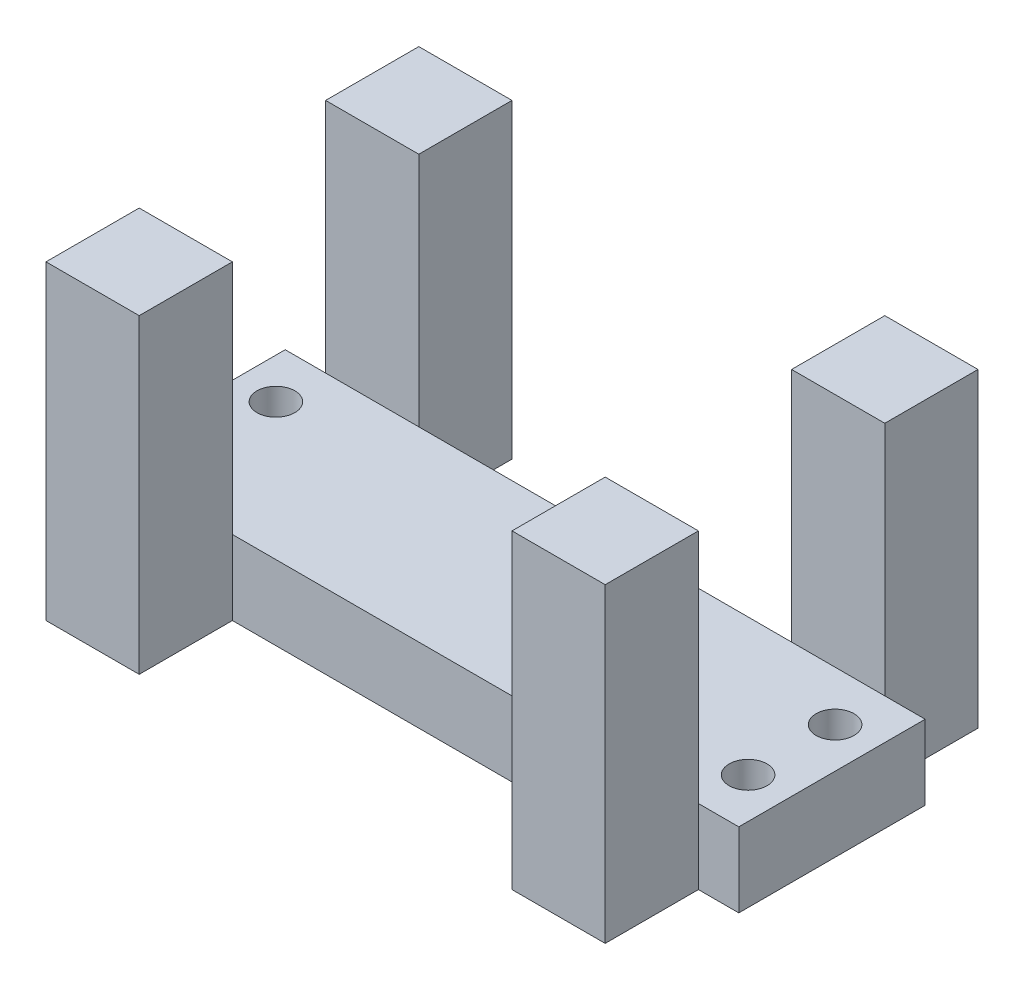
ISO-10303-21;
HEADER;
FILE_DESCRIPTION(('STEP AP214'),'2;1');
FILE_NAME('part.step','',(''),(''),'','','');
FILE_SCHEMA(('AUTOMOTIVE_DESIGN { 1 0 10303 214 1 1 1 1 }'));
ENDSEC;
DATA;
#1=APPLICATION_CONTEXT('core data for automotive mechanical design processes');
#2=APPLICATION_PROTOCOL_DEFINITION('international standard','automotive_design',2000,#1);
#3=PRODUCT_CONTEXT('',#1,'mechanical');
#4=PRODUCT('Part','Part','',(#3));
#5=PRODUCT_RELATED_PRODUCT_CATEGORY('part','',(#4));
#6=PRODUCT_DEFINITION_FORMATION('','',#4);
#7=PRODUCT_DEFINITION_CONTEXT('part definition',#1,'design');
#8=PRODUCT_DEFINITION('design','',#6,#7);
#9=PRODUCT_DEFINITION_SHAPE('','',#8);
#10=(LENGTH_UNIT() NAMED_UNIT(*) SI_UNIT(.MILLI.,.METRE.));
#11=(NAMED_UNIT(*) PLANE_ANGLE_UNIT() SI_UNIT($,.RADIAN.));
#12=(NAMED_UNIT(*) SI_UNIT($,.STERADIAN.) SOLID_ANGLE_UNIT());
#13=UNCERTAINTY_MEASURE_WITH_UNIT(LENGTH_MEASURE(1.E-05),#10,'distance_accuracy_value','');
#14=(GEOMETRIC_REPRESENTATION_CONTEXT(3) GLOBAL_UNCERTAINTY_ASSIGNED_CONTEXT((#13)) GLOBAL_UNIT_ASSIGNED_CONTEXT((#10,
#11,#12)) REPRESENTATION_CONTEXT('',''));
#15=CARTESIAN_POINT('',(0.,0.,0.));
#16=DIRECTION('',(0.,0.,1.));
#17=DIRECTION('',(1.,0.,0.));
#18=AXIS2_PLACEMENT_3D('',#15,#16,#17);
#19=CARTESIAN_POINT('',(0.,12.,0.));
#20=DIRECTION('',(0.,0.,-1.));
#21=DIRECTION('',(-1.,0.,0.));
#22=AXIS2_PLACEMENT_3D('',#19,#20,#21);
#23=PLANE('',#22);
#24=DIRECTION('',(1.,0.,0.));
#25=VECTOR('',#24,1.);
#26=CARTESIAN_POINT('',(0.,0.,0.));
#27=LINE('',#26,#25);
#28=CARTESIAN_POINT('',(0.,0.,0.));
#29=VERTEX_POINT('',#28);
#30=CARTESIAN_POINT('',(6.50000000000001,0.,0.));
#31=VERTEX_POINT('',#30);
#32=EDGE_CURVE('E388',#29,#31,#27,.T.);
#33=ORIENTED_EDGE('',*,*,#32,.T.);
#34=DIRECTION('',(0.,-1.,0.));
#35=VECTOR('',#34,1.);
#36=CARTESIAN_POINT('',(6.50000000000001,50.,0.));
#37=LINE('',#36,#35);
#38=CARTESIAN_POINT('',(6.50000000000001,12.,0.));
#39=VERTEX_POINT('',#38);
#40=EDGE_CURVE('E61',#39,#31,#37,.T.);
#41=ORIENTED_EDGE('',*,*,#40,.F.);
#42=DIRECTION('',(1.,0.,0.));
#43=VECTOR('',#42,1.);
#44=CARTESIAN_POINT('',(0.,12.,0.));
#45=LINE('',#44,#43);
#46=CARTESIAN_POINT('',(0.,12.,0.));
#47=VERTEX_POINT('',#46);
#48=EDGE_CURVE('E373',#47,#39,#45,.T.);
#49=ORIENTED_EDGE('',*,*,#48,.F.);
#50=DIRECTION('',(0.,-1.,0.));
#51=VECTOR('',#50,1.);
#52=CARTESIAN_POINT('',(0.,12.,0.));
#53=LINE('',#52,#51);
#54=EDGE_CURVE('E39',#47,#29,#53,.T.);
#55=ORIENTED_EDGE('',*,*,#54,.T.);
#56=EDGE_LOOP('',(#33,#41,#49,#55));
#57=FACE_BOUND('',#56,.T.);
#58=ADVANCED_FACE('F35',(#57),#23,.F.);
#59=CARTESIAN_POINT('',(0.,12.,-30.));
#60=DIRECTION('',(0.,0.,1.));
#61=DIRECTION('',(1.,0.,0.));
#62=AXIS2_PLACEMENT_3D('',#59,#60,#61);
#63=PLANE('',#62);
#64=DIRECTION('',(-1.,0.,0.));
#65=VECTOR('',#64,1.);
#66=CARTESIAN_POINT('',(0.,0.,-30.));
#67=LINE('',#66,#65);
#68=CARTESIAN_POINT('',(103.,0.,-30.));
#69=VERTEX_POINT('',#68);
#70=CARTESIAN_POINT('',(96.5,0.,-30.));
#71=VERTEX_POINT('',#70);
#72=EDGE_CURVE('E372',#69,#71,#67,.T.);
#73=ORIENTED_EDGE('',*,*,#72,.T.);
#74=DIRECTION('',(0.,-1.,0.));
#75=VECTOR('',#74,1.);
#76=CARTESIAN_POINT('',(96.5,50.,-30.));
#77=LINE('',#76,#75);
#78=CARTESIAN_POINT('',(96.5,12.,-30.));
#79=VERTEX_POINT('',#78);
#80=EDGE_CURVE('E259',#79,#71,#77,.T.);
#81=ORIENTED_EDGE('',*,*,#80,.F.);
#82=DIRECTION('',(-1.,0.,0.));
#83=VECTOR('',#82,1.);
#84=CARTESIAN_POINT('',(0.,12.,-30.));
#85=LINE('',#84,#83);
#86=CARTESIAN_POINT('',(103.,12.,-30.));
#87=VERTEX_POINT('',#86);
#88=EDGE_CURVE('E379',#87,#79,#85,.T.);
#89=ORIENTED_EDGE('',*,*,#88,.F.);
#90=DIRECTION('',(0.,-1.,0.));
#91=VECTOR('',#90,1.);
#92=CARTESIAN_POINT('',(103.,12.,-30.));
#93=LINE('',#92,#91);
#94=EDGE_CURVE('E398',#87,#69,#93,.T.);
#95=ORIENTED_EDGE('',*,*,#94,.T.);
#96=EDGE_LOOP('',(#73,#81,#89,#95));
#97=FACE_BOUND('',#96,.T.);
#98=ADVANCED_FACE('F460',(#97),#63,.F.);
#99=CARTESIAN_POINT('',(81.5,12.,-30.));
#100=VERTEX_POINT('',#99);
#101=CARTESIAN_POINT('',(21.5,12.,-30.));
#102=VERTEX_POINT('',#101);
#103=EDGE_CURVE('E383',#100,#102,#85,.T.);
#104=ORIENTED_EDGE('',*,*,#103,.F.);
#105=DIRECTION('',(0.,-1.,0.));
#106=VECTOR('',#105,1.);
#107=CARTESIAN_POINT('',(81.5,50.,-30.));
#108=LINE('',#107,#106);
#109=CARTESIAN_POINT('',(81.5,0.,-30.));
#110=VERTEX_POINT('',#109);
#111=EDGE_CURVE('E275',#100,#110,#108,.T.);
#112=ORIENTED_EDGE('',*,*,#111,.T.);
#113=CARTESIAN_POINT('',(21.5,0.,-30.));
#114=VERTEX_POINT('',#113);
#115=EDGE_CURVE('E395',#110,#114,#67,.T.);
#116=ORIENTED_EDGE('',*,*,#115,.T.);
#117=DIRECTION('',(0.,-1.,0.));
#118=VECTOR('',#117,1.);
#119=CARTESIAN_POINT('',(21.5,50.,-30.));
#120=LINE('',#119,#118);
#121=EDGE_CURVE('E11',#102,#114,#120,.T.);
#122=ORIENTED_EDGE('',*,*,#121,.F.);
#123=EDGE_LOOP('',(#104,#112,#116,#122));
#124=FACE_BOUND('',#123,.T.);
#125=ADVANCED_FACE('F429',(#124),#63,.F.);
#126=CARTESIAN_POINT('',(21.5,12.,0.));
#127=VERTEX_POINT('',#126);
#128=CARTESIAN_POINT('',(81.5,12.,0.));
#129=VERTEX_POINT('',#128);
#130=EDGE_CURVE('E53',#127,#129,#45,.T.);
#131=ORIENTED_EDGE('',*,*,#130,.F.);
#132=DIRECTION('',(0.,-1.,0.));
#133=VECTOR('',#132,1.);
#134=CARTESIAN_POINT('',(21.5,50.,0.));
#135=LINE('',#134,#133);
#136=CARTESIAN_POINT('',(21.5,0.,0.));
#137=VERTEX_POINT('',#136);
#138=EDGE_CURVE('E206',#127,#137,#135,.T.);
#139=ORIENTED_EDGE('',*,*,#138,.T.);
#140=CARTESIAN_POINT('',(81.5,0.,0.));
#141=VERTEX_POINT('',#140);
#142=EDGE_CURVE('E391',#137,#141,#27,.T.);
#143=ORIENTED_EDGE('',*,*,#142,.T.);
#144=DIRECTION('',(0.,-1.,0.));
#145=VECTOR('',#144,1.);
#146=CARTESIAN_POINT('',(81.5,50.,0.));
#147=LINE('',#146,#145);
#148=EDGE_CURVE('E341',#129,#141,#147,.T.);
#149=ORIENTED_EDGE('',*,*,#148,.F.);
#150=EDGE_LOOP('',(#131,#139,#143,#149));
#151=FACE_BOUND('',#150,.T.);
#152=ADVANCED_FACE('F453',(#151),#23,.F.);
#153=CARTESIAN_POINT('',(0.,12.,0.));
#154=DIRECTION('',(1.,0.,0.));
#155=DIRECTION('',(0.,0.,-1.));
#156=AXIS2_PLACEMENT_3D('',#153,#154,#155);
#157=PLANE('',#156);
#158=DIRECTION('',(0.,0.,1.));
#159=VECTOR('',#158,1.);
#160=CARTESIAN_POINT('',(0.,0.,0.));
#161=LINE('',#160,#159);
#162=CARTESIAN_POINT('',(0.,0.,-30.));
#163=VERTEX_POINT('',#162);
#164=EDGE_CURVE('E365',#163,#29,#161,.T.);
#165=ORIENTED_EDGE('',*,*,#164,.T.);
#166=ORIENTED_EDGE('',*,*,#54,.F.);
#167=DIRECTION('',(0.,0.,1.));
#168=VECTOR('',#167,1.);
#169=CARTESIAN_POINT('',(0.,12.,0.));
#170=LINE('',#169,#168);
#171=CARTESIAN_POINT('',(0.,12.,-30.));
#172=VERTEX_POINT('',#171);
#173=EDGE_CURVE('E368',#172,#47,#170,.T.);
#174=ORIENTED_EDGE('',*,*,#173,.F.);
#175=DIRECTION('',(0.,-1.,0.));
#176=VECTOR('',#175,1.);
#177=CARTESIAN_POINT('',(0.,12.,-30.));
#178=LINE('',#177,#176);
#179=EDGE_CURVE('E382',#172,#163,#178,.T.);
#180=ORIENTED_EDGE('',*,*,#179,.T.);
#181=EDGE_LOOP('',(#165,#166,#174,#180));
#182=FACE_BOUND('',#181,.T.);
#183=ADVANCED_FACE('F37',(#182),#157,.F.);
#184=CARTESIAN_POINT('',(96.5,12.,0.));
#185=VERTEX_POINT('',#184);
#186=CARTESIAN_POINT('',(103.,12.,0.));
#187=VERTEX_POINT('',#186);
#188=EDGE_CURVE('E371',#185,#187,#45,.T.);
#189=ORIENTED_EDGE('',*,*,#188,.F.);
#190=DIRECTION('',(0.,-1.,0.));
#191=VECTOR('',#190,1.);
#192=CARTESIAN_POINT('',(96.5,50.,0.));
#193=LINE('',#192,#191);
#194=CARTESIAN_POINT('',(96.5,0.,0.));
#195=VERTEX_POINT('',#194);
#196=EDGE_CURVE('E337',#185,#195,#193,.T.);
#197=ORIENTED_EDGE('',*,*,#196,.T.);
#198=CARTESIAN_POINT('',(103.,0.,0.));
#199=VERTEX_POINT('',#198);
#200=EDGE_CURVE('E387',#195,#199,#27,.T.);
#201=ORIENTED_EDGE('',*,*,#200,.T.);
#202=DIRECTION('',(0.,-1.,0.));
#203=VECTOR('',#202,1.);
#204=CARTESIAN_POINT('',(103.,12.,0.));
#205=LINE('',#204,#203);
#206=EDGE_CURVE('E400',#187,#199,#205,.T.);
#207=ORIENTED_EDGE('',*,*,#206,.F.);
#208=EDGE_LOOP('',(#189,#197,#201,#207));
#209=FACE_BOUND('',#208,.T.);
#210=ADVANCED_FACE('F452',(#209),#23,.F.);
#211=CARTESIAN_POINT('',(103.,12.,0.));
#212=DIRECTION('',(-1.,0.,0.));
#213=DIRECTION('',(0.,0.,1.));
#214=AXIS2_PLACEMENT_3D('',#211,#212,#213);
#215=PLANE('',#214);
#216=DIRECTION('',(0.,0.,-1.));
#217=VECTOR('',#216,1.);
#218=CARTESIAN_POINT('',(103.,0.,0.));
#219=LINE('',#218,#217);
#220=EDGE_CURVE('E390',#199,#69,#219,.T.);
#221=ORIENTED_EDGE('',*,*,#220,.T.);
#222=ORIENTED_EDGE('',*,*,#94,.F.);
#223=DIRECTION('',(0.,0.,-1.));
#224=VECTOR('',#223,1.);
#225=CARTESIAN_POINT('',(103.,12.,0.));
#226=LINE('',#225,#224);
#227=EDGE_CURVE('E375',#187,#87,#226,.T.);
#228=ORIENTED_EDGE('',*,*,#227,.F.);
#229=ORIENTED_EDGE('',*,*,#206,.T.);
#230=EDGE_LOOP('',(#221,#222,#228,#229));
#231=FACE_BOUND('',#230,.T.);
#232=ADVANCED_FACE('F458',(#231),#215,.F.);
#233=CARTESIAN_POINT('',(6.50000000000001,12.,-30.));
#234=VERTEX_POINT('',#233);
#235=EDGE_CURVE('E378',#234,#172,#85,.T.);
#236=ORIENTED_EDGE('',*,*,#235,.F.);
#237=DIRECTION('',(0.,-1.,0.));
#238=VECTOR('',#237,1.);
#239=CARTESIAN_POINT('',(6.50000000000001,50.,-30.));
#240=LINE('',#239,#238);
#241=CARTESIAN_POINT('',(6.50000000000001,0.,-30.));
#242=VERTEX_POINT('',#241);
#243=EDGE_CURVE('E44',#234,#242,#240,.T.);
#244=ORIENTED_EDGE('',*,*,#243,.T.);
#245=EDGE_CURVE('E393',#242,#163,#67,.T.);
#246=ORIENTED_EDGE('',*,*,#245,.T.);
#247=ORIENTED_EDGE('',*,*,#179,.F.);
#248=EDGE_LOOP('',(#236,#244,#246,#247));
#249=FACE_BOUND('',#248,.T.);
#250=ADVANCED_FACE('F419',(#249),#63,.F.);
#251=CARTESIAN_POINT('',(0.,12.,0.));
#252=DIRECTION('',(0.,-1.,0.));
#253=DIRECTION('',(0.,0.,-1.));
#254=AXIS2_PLACEMENT_3D('',#251,#252,#253);
#255=PLANE('',#254);
#256=CARTESIAN_POINT('',(6.5,12.,-22.));
#257=DIRECTION('',(0.,1.,0.));
#258=DIRECTION('',(0.,0.,-1.));
#259=AXIS2_PLACEMENT_3D('',#256,#257,#258);
#260=CIRCLE('',#259,3.05);
#261=CARTESIAN_POINT('',(6.5,12.,-25.05));
#262=VERTEX_POINT('',#261);
#263=EDGE_CURVE('E354',#262,#262,#260,.T.);
#264=ORIENTED_EDGE('',*,*,#263,.F.);
#265=EDGE_LOOP('',(#264));
#266=FACE_BOUND('',#265,.T.);
#267=CARTESIAN_POINT('',(96.5,12.,-8.00000000000001));
#268=DIRECTION('',(0.,1.,0.));
#269=DIRECTION('',(0.,0.,-1.));
#270=AXIS2_PLACEMENT_3D('',#267,#268,#269);
#271=CIRCLE('',#270,3.05000000000002);
#272=CARTESIAN_POINT('',(96.5,12.,-11.05));
#273=VERTEX_POINT('',#272);
#274=EDGE_CURVE('E347',#273,#273,#271,.T.);
#275=ORIENTED_EDGE('',*,*,#274,.F.);
#276=EDGE_LOOP('',(#275));
#277=FACE_BOUND('',#276,.T.);
#278=CARTESIAN_POINT('',(96.5,12.,-22.));
#279=DIRECTION('',(0.,1.,0.));
#280=DIRECTION('',(0.,0.,1.));
#281=AXIS2_PLACEMENT_3D('',#278,#279,#280);
#282=CIRCLE('',#281,3.05);
#283=CARTESIAN_POINT('',(96.5,12.,-18.95));
#284=VERTEX_POINT('',#283);
#285=EDGE_CURVE('E335',#284,#284,#282,.T.);
#286=ORIENTED_EDGE('',*,*,#285,.F.);
#287=EDGE_LOOP('',(#286));
#288=FACE_BOUND('',#287,.T.);
#289=CARTESIAN_POINT('',(6.5,12.,-8.));
#290=DIRECTION('',(0.,1.,0.));
#291=DIRECTION('',(0.,0.,1.));
#292=AXIS2_PLACEMENT_3D('',#289,#290,#291);
#293=CIRCLE('',#292,3.05);
#294=CARTESIAN_POINT('',(6.5,12.,-4.95));
#295=VERTEX_POINT('',#294);
#296=EDGE_CURVE('E353',#295,#295,#293,.T.);
#297=ORIENTED_EDGE('',*,*,#296,.F.);
#298=EDGE_LOOP('',(#297));
#299=FACE_BOUND('',#298,.T.);
#300=ORIENTED_EDGE('',*,*,#173,.T.);
#301=ORIENTED_EDGE('',*,*,#48,.T.);
#302=DIRECTION('',(1.,0.,0.));
#303=VECTOR('',#302,1.);
#304=CARTESIAN_POINT('',(0.,12.,0.));
#305=LINE('',#304,#303);
#306=EDGE_CURVE('E240',#39,#127,#305,.T.);
#307=ORIENTED_EDGE('',*,*,#306,.T.);
#308=ORIENTED_EDGE('',*,*,#130,.T.);
#309=EDGE_CURVE('E376',#129,#185,#45,.T.);
#310=ORIENTED_EDGE('',*,*,#309,.T.);
#311=ORIENTED_EDGE('',*,*,#188,.T.);
#312=ORIENTED_EDGE('',*,*,#227,.T.);
#313=ORIENTED_EDGE('',*,*,#88,.T.);
#314=DIRECTION('',(-1.,0.,0.));
#315=VECTOR('',#314,1.);
#316=CARTESIAN_POINT('',(0.,12.,-30.));
#317=LINE('',#316,#315);
#318=EDGE_CURVE('E269',#79,#100,#317,.T.);
#319=ORIENTED_EDGE('',*,*,#318,.T.);
#320=ORIENTED_EDGE('',*,*,#103,.T.);
#321=EDGE_CURVE('E384',#102,#234,#85,.T.);
#322=ORIENTED_EDGE('',*,*,#321,.T.);
#323=ORIENTED_EDGE('',*,*,#235,.T.);
#324=EDGE_LOOP('',(#300,#301,#307,#308,#310,#311,#312,#313,#319,#320,#322,#323));
#325=FACE_BOUND('',#324,.T.);
#326=ADVANCED_FACE('F448',(#266,#277,#288,#299,#325),#255,.F.);
#327=CARTESIAN_POINT('',(0.,0.,0.));
#328=DIRECTION('',(0.,-1.,0.));
#329=DIRECTION('',(0.,0.,-1.));
#330=AXIS2_PLACEMENT_3D('',#327,#328,#329);
#331=PLANE('',#330);
#332=CARTESIAN_POINT('',(6.5,0.,-22.));
#333=DIRECTION('',(0.,1.,0.));
#334=DIRECTION('',(0.,0.,-1.));
#335=AXIS2_PLACEMENT_3D('',#332,#333,#334);
#336=CIRCLE('',#335,3.05);
#337=CARTESIAN_POINT('',(6.5,0.,-25.05));
#338=VERTEX_POINT('',#337);
#339=EDGE_CURVE('E350',#338,#338,#336,.T.);
#340=ORIENTED_EDGE('',*,*,#339,.T.);
#341=EDGE_LOOP('',(#340));
#342=FACE_BOUND('',#341,.T.);
#343=CARTESIAN_POINT('',(96.5,0.,-8.00000000000001));
#344=DIRECTION('',(0.,1.,0.));
#345=DIRECTION('',(0.,0.,-1.));
#346=AXIS2_PLACEMENT_3D('',#343,#344,#345);
#347=CIRCLE('',#346,3.05000000000002);
#348=CARTESIAN_POINT('',(96.5,0.,-11.05));
#349=VERTEX_POINT('',#348);
#350=EDGE_CURVE('E357',#349,#349,#347,.T.);
#351=ORIENTED_EDGE('',*,*,#350,.T.);
#352=EDGE_LOOP('',(#351));
#353=FACE_BOUND('',#352,.T.);
#354=CARTESIAN_POINT('',(96.5,0.,-22.));
#355=DIRECTION('',(0.,1.,0.));
#356=DIRECTION('',(0.,0.,1.));
#357=AXIS2_PLACEMENT_3D('',#354,#355,#356);
#358=CIRCLE('',#357,3.05);
#359=CARTESIAN_POINT('',(96.5,0.,-18.95));
#360=VERTEX_POINT('',#359);
#361=EDGE_CURVE('E344',#360,#360,#358,.T.);
#362=ORIENTED_EDGE('',*,*,#361,.T.);
#363=EDGE_LOOP('',(#362));
#364=FACE_BOUND('',#363,.T.);
#365=CARTESIAN_POINT('',(6.5,0.,-8.));
#366=DIRECTION('',(0.,1.,0.));
#367=DIRECTION('',(0.,0.,1.));
#368=AXIS2_PLACEMENT_3D('',#365,#366,#367);
#369=CIRCLE('',#368,3.05);
#370=CARTESIAN_POINT('',(6.5,0.,-4.95));
#371=VERTEX_POINT('',#370);
#372=EDGE_CURVE('E362',#371,#371,#369,.T.);
#373=ORIENTED_EDGE('',*,*,#372,.T.);
#374=EDGE_LOOP('',(#373));
#375=FACE_BOUND('',#374,.T.);
#376=ORIENTED_EDGE('',*,*,#164,.F.);
#377=ORIENTED_EDGE('',*,*,#245,.F.);
#378=DIRECTION('',(0.,0.,-1.));
#379=VECTOR('',#378,1.);
#380=CARTESIAN_POINT('',(6.50000000000001,0.,-30.));
#381=LINE('',#380,#379);
#382=CARTESIAN_POINT('',(6.50000000000001,0.,-45.));
#383=VERTEX_POINT('',#382);
#384=EDGE_CURVE('E281',#242,#383,#381,.T.);
#385=ORIENTED_EDGE('',*,*,#384,.T.);
#386=DIRECTION('',(1.,0.,0.));
#387=VECTOR('',#386,1.);
#388=CARTESIAN_POINT('',(6.50000000000001,0.,-45.));
#389=LINE('',#388,#387);
#390=CARTESIAN_POINT('',(21.5,0.,-45.));
#391=VERTEX_POINT('',#390);
#392=EDGE_CURVE('E298',#383,#391,#389,.T.);
#393=ORIENTED_EDGE('',*,*,#392,.T.);
#394=DIRECTION('',(0.,0.,1.));
#395=VECTOR('',#394,1.);
#396=CARTESIAN_POINT('',(21.5,0.,-30.));
#397=LINE('',#396,#395);
#398=EDGE_CURVE('E286',#391,#114,#397,.T.);
#399=ORIENTED_EDGE('',*,*,#398,.T.);
#400=ORIENTED_EDGE('',*,*,#115,.F.);
#401=DIRECTION('',(0.,0.,-1.));
#402=VECTOR('',#401,1.);
#403=CARTESIAN_POINT('',(81.5,0.,-30.));
#404=LINE('',#403,#402);
#405=CARTESIAN_POINT('',(81.5,0.,-45.));
#406=VERTEX_POINT('',#405);
#407=EDGE_CURVE('E262',#110,#406,#404,.T.);
#408=ORIENTED_EDGE('',*,*,#407,.T.);
#409=DIRECTION('',(1.,0.,0.));
#410=VECTOR('',#409,1.);
#411=CARTESIAN_POINT('',(96.5,0.,-45.));
#412=LINE('',#411,#410);
#413=CARTESIAN_POINT('',(96.5,0.,-45.));
#414=VERTEX_POINT('',#413);
#415=EDGE_CURVE('E250',#406,#414,#412,.T.);
#416=ORIENTED_EDGE('',*,*,#415,.T.);
#417=DIRECTION('',(0.,0.,1.));
#418=VECTOR('',#417,1.);
#419=CARTESIAN_POINT('',(96.5,0.,-30.));
#420=LINE('',#419,#418);
#421=EDGE_CURVE('E245',#414,#71,#420,.T.);
#422=ORIENTED_EDGE('',*,*,#421,.T.);
#423=ORIENTED_EDGE('',*,*,#72,.F.);
#424=ORIENTED_EDGE('',*,*,#220,.F.);
#425=ORIENTED_EDGE('',*,*,#200,.F.);
#426=DIRECTION('',(0.,0.,1.));
#427=VECTOR('',#426,1.);
#428=CARTESIAN_POINT('',(96.5,0.,0.));
#429=LINE('',#428,#427);
#430=CARTESIAN_POINT('',(96.5,0.,15.));
#431=VERTEX_POINT('',#430);
#432=EDGE_CURVE('E304',#195,#431,#429,.T.);
#433=ORIENTED_EDGE('',*,*,#432,.T.);
#434=DIRECTION('',(-1.,0.,0.));
#435=VECTOR('',#434,1.);
#436=CARTESIAN_POINT('',(96.5,0.,15.));
#437=LINE('',#436,#435);
#438=CARTESIAN_POINT('',(81.5,0.,15.));
#439=VERTEX_POINT('',#438);
#440=EDGE_CURVE('E327',#431,#439,#437,.T.);
#441=ORIENTED_EDGE('',*,*,#440,.T.);
#442=DIRECTION('',(0.,0.,-1.));
#443=VECTOR('',#442,1.);
#444=CARTESIAN_POINT('',(81.5,0.,0.));
#445=LINE('',#444,#443);
#446=EDGE_CURVE('E315',#439,#141,#445,.T.);
#447=ORIENTED_EDGE('',*,*,#446,.T.);
#448=ORIENTED_EDGE('',*,*,#142,.F.);
#449=DIRECTION('',(0.,0.,1.));
#450=VECTOR('',#449,1.);
#451=CARTESIAN_POINT('',(21.5,0.,0.));
#452=LINE('',#451,#450);
#453=CARTESIAN_POINT('',(21.5,0.,15.));
#454=VERTEX_POINT('',#453);
#455=EDGE_CURVE('E234',#137,#454,#452,.T.);
#456=ORIENTED_EDGE('',*,*,#455,.T.);
#457=DIRECTION('',(-1.,0.,0.));
#458=VECTOR('',#457,1.);
#459=CARTESIAN_POINT('',(6.50000000000001,0.,15.));
#460=LINE('',#459,#458);
#461=CARTESIAN_POINT('',(6.50000000000001,0.,15.));
#462=VERTEX_POINT('',#461);
#463=EDGE_CURVE('E228',#454,#462,#460,.T.);
#464=ORIENTED_EDGE('',*,*,#463,.T.);
#465=DIRECTION('',(0.,0.,-1.));
#466=VECTOR('',#465,1.);
#467=CARTESIAN_POINT('',(6.50000000000001,0.,0.));
#468=LINE('',#467,#466);
#469=EDGE_CURVE('E225',#462,#31,#468,.T.);
#470=ORIENTED_EDGE('',*,*,#469,.T.);
#471=ORIENTED_EDGE('',*,*,#32,.F.);
#472=EDGE_LOOP('',(#376,#377,#385,#393,#399,#400,#408,#416,#422,#423,#424,#425,#433,#441,#447,
#448,#456,#464,#470,#471));
#473=FACE_BOUND('',#472,.T.);
#474=ADVANCED_FACE('F425',(#342,#353,#364,#375,#473),#331,.T.);
#475=CARTESIAN_POINT('',(6.5,0.,-8.));
#476=DIRECTION('',(0.,1.,0.));
#477=DIRECTION('',(0.,0.,1.));
#478=AXIS2_PLACEMENT_3D('',#475,#476,#477);
#479=CYLINDRICAL_SURFACE('',#478,3.05);
#480=ORIENTED_EDGE('',*,*,#372,.F.);
#481=EDGE_LOOP('',(#480));
#482=FACE_BOUND('',#481,.T.);
#483=ORIENTED_EDGE('',*,*,#296,.T.);
#484=EDGE_LOOP('',(#483));
#485=FACE_BOUND('',#484,.T.);
#486=ADVANCED_FACE('F472',(#482,#485),#479,.F.);
#487=CARTESIAN_POINT('',(96.5,0.,-22.));
#488=DIRECTION('',(0.,1.,0.));
#489=DIRECTION('',(0.,0.,1.));
#490=AXIS2_PLACEMENT_3D('',#487,#488,#489);
#491=CYLINDRICAL_SURFACE('',#490,3.05);
#492=ORIENTED_EDGE('',*,*,#361,.F.);
#493=EDGE_LOOP('',(#492));
#494=FACE_BOUND('',#493,.T.);
#495=ORIENTED_EDGE('',*,*,#285,.T.);
#496=EDGE_LOOP('',(#495));
#497=FACE_BOUND('',#496,.T.);
#498=ADVANCED_FACE('F479',(#494,#497),#491,.F.);
#499=CARTESIAN_POINT('',(96.5,0.,-8.00000000000001));
#500=DIRECTION('',(0.,1.,0.));
#501=DIRECTION('',(0.,0.,1.));
#502=AXIS2_PLACEMENT_3D('',#499,#500,#501);
#503=CYLINDRICAL_SURFACE('',#502,3.05000000000002);
#504=ORIENTED_EDGE('',*,*,#350,.F.);
#505=EDGE_LOOP('',(#504));
#506=FACE_BOUND('',#505,.T.);
#507=ORIENTED_EDGE('',*,*,#274,.T.);
#508=EDGE_LOOP('',(#507));
#509=FACE_BOUND('',#508,.T.);
#510=ADVANCED_FACE('F481',(#506,#509),#503,.F.);
#511=CARTESIAN_POINT('',(6.5,0.,-22.));
#512=DIRECTION('',(0.,1.,0.));
#513=DIRECTION('',(0.,0.,1.));
#514=AXIS2_PLACEMENT_3D('',#511,#512,#513);
#515=CYLINDRICAL_SURFACE('',#514,3.05);
#516=ORIENTED_EDGE('',*,*,#339,.F.);
#517=EDGE_LOOP('',(#516));
#518=FACE_BOUND('',#517,.T.);
#519=ORIENTED_EDGE('',*,*,#263,.T.);
#520=EDGE_LOOP('',(#519));
#521=FACE_BOUND('',#520,.T.);
#522=ADVANCED_FACE('F484',(#518,#521),#515,.F.);
#523=CARTESIAN_POINT('',(96.5,50.,0.));
#524=DIRECTION('',(0.,0.,-1.));
#525=DIRECTION('',(-1.,0.,0.));
#526=AXIS2_PLACEMENT_3D('',#523,#524,#525);
#527=PLANE('',#526);
#528=ORIENTED_EDGE('',*,*,#309,.F.);
#529=CARTESIAN_POINT('',(81.5,50.,0.));
#530=VERTEX_POINT('',#529);
#531=EDGE_CURVE('E336',#530,#129,#147,.T.);
#532=ORIENTED_EDGE('',*,*,#531,.F.);
#533=DIRECTION('',(1.,0.,0.));
#534=VECTOR('',#533,1.);
#535=CARTESIAN_POINT('',(96.5,50.,0.));
#536=LINE('',#535,#534);
#537=CARTESIAN_POINT('',(96.5,50.,0.));
#538=VERTEX_POINT('',#537);
#539=EDGE_CURVE('E321',#530,#538,#536,.T.);
#540=ORIENTED_EDGE('',*,*,#539,.T.);
#541=EDGE_CURVE('E332',#538,#185,#193,.T.);
#542=ORIENTED_EDGE('',*,*,#541,.T.);
#543=EDGE_LOOP('',(#528,#532,#540,#542));
#544=FACE_BOUND('',#543,.T.);
#545=ADVANCED_FACE('F488',(#544),#527,.T.);
#546=CARTESIAN_POINT('',(96.5,50.,0.));
#547=DIRECTION('',(1.,0.,0.));
#548=DIRECTION('',(0.,0.,-1.));
#549=AXIS2_PLACEMENT_3D('',#546,#547,#548);
#550=PLANE('',#549);
#551=ORIENTED_EDGE('',*,*,#432,.F.);
#552=ORIENTED_EDGE('',*,*,#196,.F.);
#553=ORIENTED_EDGE('',*,*,#541,.F.);
#554=DIRECTION('',(0.,0.,1.));
#555=VECTOR('',#554,1.);
#556=CARTESIAN_POINT('',(96.5,50.,0.));
#557=LINE('',#556,#555);
#558=CARTESIAN_POINT('',(96.5,50.,15.));
#559=VERTEX_POINT('',#558);
#560=EDGE_CURVE('E311',#538,#559,#557,.T.);
#561=ORIENTED_EDGE('',*,*,#560,.T.);
#562=DIRECTION('',(0.,-1.,0.));
#563=VECTOR('',#562,1.);
#564=CARTESIAN_POINT('',(96.5,50.,15.));
#565=LINE('',#564,#563);
#566=EDGE_CURVE('E324',#559,#431,#565,.T.);
#567=ORIENTED_EDGE('',*,*,#566,.T.);
#568=EDGE_LOOP('',(#551,#552,#553,#561,#567));
#569=FACE_BOUND('',#568,.T.);
#570=ADVANCED_FACE('F493',(#569),#550,.T.);
#571=CARTESIAN_POINT('',(81.5,50.,0.));
#572=DIRECTION('',(-1.,0.,0.));
#573=DIRECTION('',(0.,0.,1.));
#574=AXIS2_PLACEMENT_3D('',#571,#572,#573);
#575=PLANE('',#574);
#576=ORIENTED_EDGE('',*,*,#446,.F.);
#577=DIRECTION('',(0.,-1.,0.));
#578=VECTOR('',#577,1.);
#579=CARTESIAN_POINT('',(81.5,50.,15.));
#580=LINE('',#579,#578);
#581=CARTESIAN_POINT('',(81.5,50.,15.));
#582=VERTEX_POINT('',#581);
#583=EDGE_CURVE('E340',#582,#439,#580,.T.);
#584=ORIENTED_EDGE('',*,*,#583,.F.);
#585=DIRECTION('',(0.,0.,-1.));
#586=VECTOR('',#585,1.);
#587=CARTESIAN_POINT('',(81.5,50.,0.));
#588=LINE('',#587,#586);
#589=EDGE_CURVE('E318',#582,#530,#588,.T.);
#590=ORIENTED_EDGE('',*,*,#589,.T.);
#591=ORIENTED_EDGE('',*,*,#531,.T.);
#592=ORIENTED_EDGE('',*,*,#148,.T.);
#593=EDGE_LOOP('',(#576,#584,#590,#591,#592));
#594=FACE_BOUND('',#593,.T.);
#595=ADVANCED_FACE('F496',(#594),#575,.T.);
#596=CARTESIAN_POINT('',(96.5,50.,15.));
#597=DIRECTION('',(0.,0.,1.));
#598=DIRECTION('',(1.,0.,0.));
#599=AXIS2_PLACEMENT_3D('',#596,#597,#598);
#600=PLANE('',#599);
#601=ORIENTED_EDGE('',*,*,#440,.F.);
#602=ORIENTED_EDGE('',*,*,#566,.F.);
#603=DIRECTION('',(-1.,0.,0.));
#604=VECTOR('',#603,1.);
#605=CARTESIAN_POINT('',(96.5,50.,15.));
#606=LINE('',#605,#604);
#607=EDGE_CURVE('E314',#559,#582,#606,.T.);
#608=ORIENTED_EDGE('',*,*,#607,.T.);
#609=ORIENTED_EDGE('',*,*,#583,.T.);
#610=EDGE_LOOP('',(#601,#602,#608,#609));
#611=FACE_BOUND('',#610,.T.);
#612=ADVANCED_FACE('F498',(#611),#600,.T.);
#613=CARTESIAN_POINT('',(0.,50.,0.));
#614=DIRECTION('',(0.,-1.,0.));
#615=DIRECTION('',(0.,0.,-1.));
#616=AXIS2_PLACEMENT_3D('',#613,#614,#615);
#617=PLANE('',#616);
#618=ORIENTED_EDGE('',*,*,#560,.F.);
#619=ORIENTED_EDGE('',*,*,#539,.F.);
#620=ORIENTED_EDGE('',*,*,#589,.F.);
#621=ORIENTED_EDGE('',*,*,#607,.F.);
#622=EDGE_LOOP('',(#618,#619,#620,#621));
#623=FACE_BOUND('',#622,.T.);
#624=ADVANCED_FACE('F501',(#623),#617,.F.);
#625=CARTESIAN_POINT('',(6.50000000000001,50.,-30.));
#626=DIRECTION('',(0.,0.,1.));
#627=DIRECTION('',(1.,0.,0.));
#628=AXIS2_PLACEMENT_3D('',#625,#626,#627);
#629=PLANE('',#628);
#630=ORIENTED_EDGE('',*,*,#321,.F.);
#631=CARTESIAN_POINT('',(21.5,50.,-30.));
#632=VERTEX_POINT('',#631);
#633=EDGE_CURVE('E46',#632,#102,#120,.T.);
#634=ORIENTED_EDGE('',*,*,#633,.F.);
#635=DIRECTION('',(-1.,0.,0.));
#636=VECTOR('',#635,1.);
#637=CARTESIAN_POINT('',(6.50000000000001,50.,-30.));
#638=LINE('',#637,#636);
#639=CARTESIAN_POINT('',(6.50000000000001,50.,-30.));
#640=VERTEX_POINT('',#639);
#641=EDGE_CURVE('E282',#632,#640,#638,.T.);
#642=ORIENTED_EDGE('',*,*,#641,.T.);
#643=EDGE_CURVE('E295',#640,#234,#240,.T.);
#644=ORIENTED_EDGE('',*,*,#643,.T.);
#645=EDGE_LOOP('',(#630,#634,#642,#644));
#646=FACE_BOUND('',#645,.T.);
#647=ADVANCED_FACE('F446',(#646),#629,.T.);
#648=CARTESIAN_POINT('',(21.5,50.,-30.));
#649=DIRECTION('',(1.,0.,0.));
#650=DIRECTION('',(0.,0.,-1.));
#651=AXIS2_PLACEMENT_3D('',#648,#649,#650);
#652=PLANE('',#651);
#653=ORIENTED_EDGE('',*,*,#398,.F.);
#654=DIRECTION('',(0.,-1.,0.));
#655=VECTOR('',#654,1.);
#656=CARTESIAN_POINT('',(21.5,50.,-45.));
#657=LINE('',#656,#655);
#658=CARTESIAN_POINT('',(21.5,50.,-45.));
#659=VERTEX_POINT('',#658);
#660=EDGE_CURVE('E305',#659,#391,#657,.T.);
#661=ORIENTED_EDGE('',*,*,#660,.F.);
#662=DIRECTION('',(0.,0.,1.));
#663=VECTOR('',#662,1.);
#664=CARTESIAN_POINT('',(21.5,50.,-30.));
#665=LINE('',#664,#663);
#666=EDGE_CURVE('E292',#659,#632,#665,.T.);
#667=ORIENTED_EDGE('',*,*,#666,.T.);
#668=ORIENTED_EDGE('',*,*,#633,.T.);
#669=ORIENTED_EDGE('',*,*,#121,.T.);
#670=EDGE_LOOP('',(#653,#661,#667,#668,#669));
#671=FACE_BOUND('',#670,.T.);
#672=ADVANCED_FACE('F434',(#671),#652,.T.);
#673=CARTESIAN_POINT('',(6.50000000000001,50.,-45.));
#674=DIRECTION('',(0.,0.,-1.));
#675=DIRECTION('',(-1.,0.,0.));
#676=AXIS2_PLACEMENT_3D('',#673,#674,#675);
#677=PLANE('',#676);
#678=ORIENTED_EDGE('',*,*,#392,.F.);
#679=DIRECTION('',(0.,-1.,0.));
#680=VECTOR('',#679,1.);
#681=CARTESIAN_POINT('',(6.50000000000001,50.,-45.));
#682=LINE('',#681,#680);
#683=CARTESIAN_POINT('',(6.50000000000001,50.,-45.));
#684=VERTEX_POINT('',#683);
#685=EDGE_CURVE('E307',#684,#383,#682,.T.);
#686=ORIENTED_EDGE('',*,*,#685,.F.);
#687=DIRECTION('',(1.,0.,0.));
#688=VECTOR('',#687,1.);
#689=CARTESIAN_POINT('',(6.50000000000001,50.,-45.));
#690=LINE('',#689,#688);
#691=EDGE_CURVE('E289',#684,#659,#690,.T.);
#692=ORIENTED_EDGE('',*,*,#691,.T.);
#693=ORIENTED_EDGE('',*,*,#660,.T.);
#694=EDGE_LOOP('',(#678,#686,#692,#693));
#695=FACE_BOUND('',#694,.T.);
#696=ADVANCED_FACE('F437',(#695),#677,.T.);
#697=CARTESIAN_POINT('',(6.50000000000001,50.,-30.));
#698=DIRECTION('',(-1.,0.,0.));
#699=DIRECTION('',(0.,0.,1.));
#700=AXIS2_PLACEMENT_3D('',#697,#698,#699);
#701=PLANE('',#700);
#702=ORIENTED_EDGE('',*,*,#384,.F.);
#703=ORIENTED_EDGE('',*,*,#243,.F.);
#704=ORIENTED_EDGE('',*,*,#643,.F.);
#705=DIRECTION('',(0.,0.,-1.));
#706=VECTOR('',#705,1.);
#707=CARTESIAN_POINT('',(6.50000000000001,50.,-30.));
#708=LINE('',#707,#706);
#709=EDGE_CURVE('E285',#640,#684,#708,.T.);
#710=ORIENTED_EDGE('',*,*,#709,.T.);
#711=ORIENTED_EDGE('',*,*,#685,.T.);
#712=EDGE_LOOP('',(#702,#703,#704,#710,#711));
#713=FACE_BOUND('',#712,.T.);
#714=ADVANCED_FACE('F513',(#713),#701,.T.);
#715=CARTESIAN_POINT('',(0.,50.,0.));
#716=DIRECTION('',(0.,1.,0.));
#717=DIRECTION('',(0.,0.,1.));
#718=AXIS2_PLACEMENT_3D('',#715,#716,#717);
#719=PLANE('',#718);
#720=ORIENTED_EDGE('',*,*,#641,.F.);
#721=ORIENTED_EDGE('',*,*,#666,.F.);
#722=ORIENTED_EDGE('',*,*,#691,.F.);
#723=ORIENTED_EDGE('',*,*,#709,.F.);
#724=EDGE_LOOP('',(#720,#721,#722,#723));
#725=FACE_BOUND('',#724,.T.);
#726=ADVANCED_FACE('F442',(#725),#719,.T.);
#727=CARTESIAN_POINT('',(96.5,50.,-30.));
#728=DIRECTION('',(0.,0.,1.));
#729=DIRECTION('',(1.,0.,0.));
#730=AXIS2_PLACEMENT_3D('',#727,#728,#729);
#731=PLANE('',#730);
#732=ORIENTED_EDGE('',*,*,#318,.F.);
#733=CARTESIAN_POINT('',(96.5,50.,-30.));
#734=VERTEX_POINT('',#733);
#735=EDGE_CURVE('E276',#734,#79,#77,.T.);
#736=ORIENTED_EDGE('',*,*,#735,.F.);
#737=DIRECTION('',(-1.,0.,0.));
#738=VECTOR('',#737,1.);
#739=CARTESIAN_POINT('',(96.5,50.,-30.));
#740=LINE('',#739,#738);
#741=CARTESIAN_POINT('',(81.5,50.,-30.));
#742=VERTEX_POINT('',#741);
#743=EDGE_CURVE('E249',#734,#742,#740,.T.);
#744=ORIENTED_EDGE('',*,*,#743,.T.);
#745=EDGE_CURVE('E272',#742,#100,#108,.T.);
#746=ORIENTED_EDGE('',*,*,#745,.T.);
#747=EDGE_LOOP('',(#732,#736,#744,#746));
#748=FACE_BOUND('',#747,.T.);
#749=ADVANCED_FACE('F522',(#748),#731,.T.);
#750=CARTESIAN_POINT('',(96.5,50.,-30.));
#751=DIRECTION('',(1.,0.,0.));
#752=DIRECTION('',(0.,0.,-1.));
#753=AXIS2_PLACEMENT_3D('',#750,#751,#752);
#754=PLANE('',#753);
#755=ORIENTED_EDGE('',*,*,#421,.F.);
#756=DIRECTION('',(0.,-1.,0.));
#757=VECTOR('',#756,1.);
#758=CARTESIAN_POINT('',(96.5,50.,-45.));
#759=LINE('',#758,#757);
#760=CARTESIAN_POINT('',(96.5,50.,-45.));
#761=VERTEX_POINT('',#760);
#762=EDGE_CURVE('E267',#761,#414,#759,.T.);
#763=ORIENTED_EDGE('',*,*,#762,.F.);
#764=DIRECTION('',(0.,0.,1.));
#765=VECTOR('',#764,1.);
#766=CARTESIAN_POINT('',(96.5,50.,-30.));
#767=LINE('',#766,#765);
#768=EDGE_CURVE('E246',#761,#734,#767,.T.);
#769=ORIENTED_EDGE('',*,*,#768,.T.);
#770=ORIENTED_EDGE('',*,*,#735,.T.);
#771=ORIENTED_EDGE('',*,*,#80,.T.);
#772=EDGE_LOOP('',(#755,#763,#769,#770,#771));
#773=FACE_BOUND('',#772,.T.);
#774=ADVANCED_FACE('F523',(#773),#754,.T.);
#775=CARTESIAN_POINT('',(96.5,50.,-45.));
#776=DIRECTION('',(0.,0.,-1.));
#777=DIRECTION('',(-1.,0.,0.));
#778=AXIS2_PLACEMENT_3D('',#775,#776,#777);
#779=PLANE('',#778);
#780=ORIENTED_EDGE('',*,*,#415,.F.);
#781=DIRECTION('',(0.,-1.,0.));
#782=VECTOR('',#781,1.);
#783=CARTESIAN_POINT('',(81.5,50.,-45.));
#784=LINE('',#783,#782);
#785=CARTESIAN_POINT('',(81.5,50.,-45.));
#786=VERTEX_POINT('',#785);
#787=EDGE_CURVE('E270',#786,#406,#784,.T.);
#788=ORIENTED_EDGE('',*,*,#787,.F.);
#789=DIRECTION('',(1.,0.,0.));
#790=VECTOR('',#789,1.);
#791=CARTESIAN_POINT('',(96.5,50.,-45.));
#792=LINE('',#791,#790);
#793=EDGE_CURVE('E256',#786,#761,#792,.T.);
#794=ORIENTED_EDGE('',*,*,#793,.T.);
#795=ORIENTED_EDGE('',*,*,#762,.T.);
#796=EDGE_LOOP('',(#780,#788,#794,#795));
#797=FACE_BOUND('',#796,.T.);
#798=ADVANCED_FACE('F526',(#797),#779,.T.);
#799=CARTESIAN_POINT('',(81.5,50.,-30.));
#800=DIRECTION('',(-1.,0.,0.));
#801=DIRECTION('',(0.,0.,1.));
#802=AXIS2_PLACEMENT_3D('',#799,#800,#801);
#803=PLANE('',#802);
#804=ORIENTED_EDGE('',*,*,#407,.F.);
#805=ORIENTED_EDGE('',*,*,#111,.F.);
#806=ORIENTED_EDGE('',*,*,#745,.F.);
#807=DIRECTION('',(0.,0.,-1.));
#808=VECTOR('',#807,1.);
#809=CARTESIAN_POINT('',(81.5,50.,-30.));
#810=LINE('',#809,#808);
#811=EDGE_CURVE('E253',#742,#786,#810,.T.);
#812=ORIENTED_EDGE('',*,*,#811,.T.);
#813=ORIENTED_EDGE('',*,*,#787,.T.);
#814=EDGE_LOOP('',(#804,#805,#806,#812,#813));
#815=FACE_BOUND('',#814,.T.);
#816=ADVANCED_FACE('F531',(#815),#803,.T.);
#817=CARTESIAN_POINT('',(0.,50.,0.));
#818=DIRECTION('',(0.,1.,0.));
#819=DIRECTION('',(0.,0.,1.));
#820=AXIS2_PLACEMENT_3D('',#817,#818,#819);
#821=PLANE('',#820);
#822=ORIENTED_EDGE('',*,*,#768,.F.);
#823=ORIENTED_EDGE('',*,*,#793,.F.);
#824=ORIENTED_EDGE('',*,*,#811,.F.);
#825=ORIENTED_EDGE('',*,*,#743,.F.);
#826=EDGE_LOOP('',(#822,#823,#824,#825));
#827=FACE_BOUND('',#826,.T.);
#828=ADVANCED_FACE('F534',(#827),#821,.T.);
#829=CARTESIAN_POINT('',(6.50000000000001,50.,0.));
#830=DIRECTION('',(0.,0.,-1.));
#831=DIRECTION('',(-1.,0.,0.));
#832=AXIS2_PLACEMENT_3D('',#829,#830,#831);
#833=PLANE('',#832);
#834=ORIENTED_EDGE('',*,*,#306,.F.);
#835=CARTESIAN_POINT('',(6.50000000000001,50.,0.));
#836=VERTEX_POINT('',#835);
#837=EDGE_CURVE('E224',#836,#39,#37,.T.);
#838=ORIENTED_EDGE('',*,*,#837,.F.);
#839=DIRECTION('',(1.,0.,0.));
#840=VECTOR('',#839,1.);
#841=CARTESIAN_POINT('',(6.50000000000001,50.,0.));
#842=LINE('',#841,#840);
#843=CARTESIAN_POINT('',(21.5,50.,0.));
#844=VERTEX_POINT('',#843);
#845=EDGE_CURVE('E217',#836,#844,#842,.T.);
#846=ORIENTED_EDGE('',*,*,#845,.T.);
#847=EDGE_CURVE('E201',#844,#127,#135,.T.);
#848=ORIENTED_EDGE('',*,*,#847,.T.);
#849=EDGE_LOOP('',(#834,#838,#846,#848));
#850=FACE_BOUND('',#849,.T.);
#851=ADVANCED_FACE('F222',(#850),#833,.T.);
#852=CARTESIAN_POINT('',(6.50000000000001,50.,0.));
#853=DIRECTION('',(-1.,0.,0.));
#854=DIRECTION('',(0.,0.,1.));
#855=AXIS2_PLACEMENT_3D('',#852,#853,#854);
#856=PLANE('',#855);
#857=ORIENTED_EDGE('',*,*,#469,.F.);
#858=DIRECTION('',(0.,-1.,0.));
#859=VECTOR('',#858,1.);
#860=CARTESIAN_POINT('',(6.50000000000001,50.,15.));
#861=LINE('',#860,#859);
#862=CARTESIAN_POINT('',(6.50000000000001,50.,15.));
#863=VERTEX_POINT('',#862);
#864=EDGE_CURVE('E241',#863,#462,#861,.T.);
#865=ORIENTED_EDGE('',*,*,#864,.F.);
#866=DIRECTION('',(0.,0.,-1.));
#867=VECTOR('',#866,1.);
#868=CARTESIAN_POINT('',(6.50000000000001,50.,0.));
#869=LINE('',#868,#867);
#870=EDGE_CURVE('E232',#863,#836,#869,.T.);
#871=ORIENTED_EDGE('',*,*,#870,.T.);
#872=ORIENTED_EDGE('',*,*,#837,.T.);
#873=ORIENTED_EDGE('',*,*,#40,.T.);
#874=EDGE_LOOP('',(#857,#865,#871,#872,#873));
#875=FACE_BOUND('',#874,.T.);
#876=ADVANCED_FACE('F544',(#875),#856,.T.);
#877=CARTESIAN_POINT('',(6.50000000000001,50.,15.));
#878=DIRECTION('',(0.,0.,1.));
#879=DIRECTION('',(1.,0.,0.));
#880=AXIS2_PLACEMENT_3D('',#877,#878,#879);
#881=PLANE('',#880);
#882=ORIENTED_EDGE('',*,*,#463,.F.);
#883=DIRECTION('',(0.,-1.,0.));
#884=VECTOR('',#883,1.);
#885=CARTESIAN_POINT('',(21.5,50.,15.));
#886=LINE('',#885,#884);
#887=CARTESIAN_POINT('',(21.5,50.,15.));
#888=VERTEX_POINT('',#887);
#889=EDGE_CURVE('E210',#888,#454,#886,.T.);
#890=ORIENTED_EDGE('',*,*,#889,.F.);
#891=DIRECTION('',(-1.,0.,0.));
#892=VECTOR('',#891,1.);
#893=CARTESIAN_POINT('',(6.50000000000001,50.,15.));
#894=LINE('',#893,#892);
#895=EDGE_CURVE('E220',#888,#863,#894,.T.);
#896=ORIENTED_EDGE('',*,*,#895,.T.);
#897=ORIENTED_EDGE('',*,*,#864,.T.);
#898=EDGE_LOOP('',(#882,#890,#896,#897));
#899=FACE_BOUND('',#898,.T.);
#900=ADVANCED_FACE('F547',(#899),#881,.T.);
#901=CARTESIAN_POINT('',(21.5,50.,0.));
#902=DIRECTION('',(1.,0.,0.));
#903=DIRECTION('',(0.,0.,-1.));
#904=AXIS2_PLACEMENT_3D('',#901,#902,#903);
#905=PLANE('',#904);
#906=ORIENTED_EDGE('',*,*,#455,.F.);
#907=ORIENTED_EDGE('',*,*,#138,.F.);
#908=ORIENTED_EDGE('',*,*,#847,.F.);
#909=DIRECTION('',(0.,0.,1.));
#910=VECTOR('',#909,1.);
#911=CARTESIAN_POINT('',(21.5,50.,0.));
#912=LINE('',#911,#910);
#913=EDGE_CURVE('E205',#844,#888,#912,.T.);
#914=ORIENTED_EDGE('',*,*,#913,.T.);
#915=ORIENTED_EDGE('',*,*,#889,.T.);
#916=EDGE_LOOP('',(#906,#907,#908,#914,#915));
#917=FACE_BOUND('',#916,.T.);
#918=ADVANCED_FACE('F204',(#917),#905,.T.);
#919=CARTESIAN_POINT('',(0.,50.,0.));
#920=DIRECTION('',(0.,-1.,0.));
#921=DIRECTION('',(0.,0.,-1.));
#922=AXIS2_PLACEMENT_3D('',#919,#920,#921);
#923=PLANE('',#922);
#924=ORIENTED_EDGE('',*,*,#845,.F.);
#925=ORIENTED_EDGE('',*,*,#870,.F.);
#926=ORIENTED_EDGE('',*,*,#895,.F.);
#927=ORIENTED_EDGE('',*,*,#913,.F.);
#928=EDGE_LOOP('',(#924,#925,#926,#927));
#929=FACE_BOUND('',#928,.T.);
#930=ADVANCED_FACE('F215',(#929),#923,.F.);
#931=CLOSED_SHELL('',(#58,#98,#125,#152,#183,#210,#232,#250,#326,#474,#486,#498,#510,#522,#545,
#570,#595,#612,#624,#647,#672,#696,#714,#726,#749,#774,#798,#816,#828,#851,#876,#900,#918,#930));
#932=MANIFOLD_SOLID_BREP('B2',#931);
#933=ADVANCED_BREP_SHAPE_REPRESENTATION('',(#18,#932),#14);
#934=SHAPE_DEFINITION_REPRESENTATION(#9,#933);
ENDSEC;
END-ISO-10303-21;
